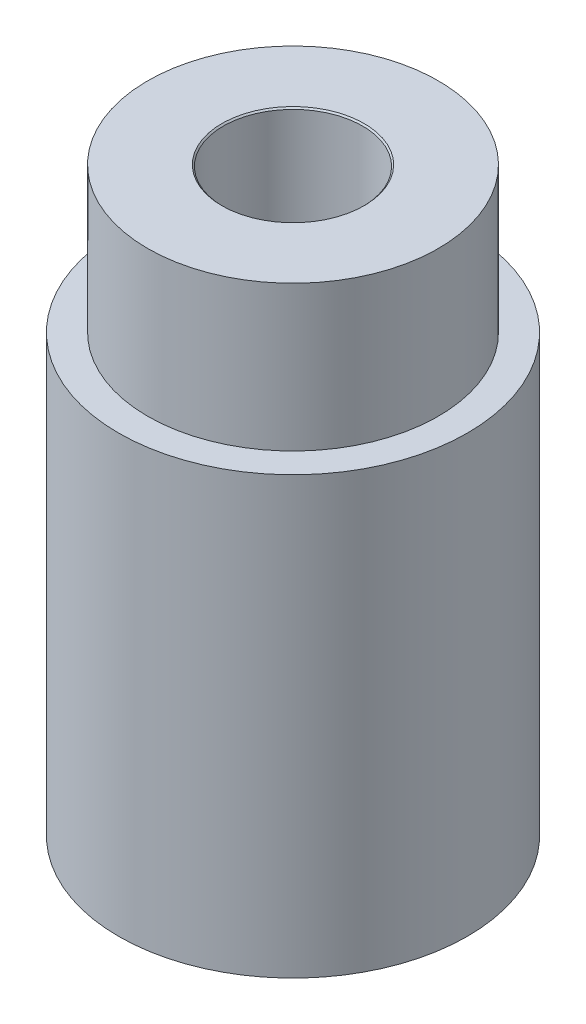
ISO-10303-21;
HEADER;
FILE_DESCRIPTION(('STEP AP214'),'2;1');
FILE_NAME('part.step','',(''),(''),'','','');
FILE_SCHEMA(('AUTOMOTIVE_DESIGN { 1 0 10303 214 1 1 1 1 }'));
ENDSEC;
DATA;
#1=APPLICATION_CONTEXT('core data for automotive mechanical design processes');
#2=APPLICATION_PROTOCOL_DEFINITION('international standard','automotive_design',2000,#1);
#3=PRODUCT_CONTEXT('',#1,'mechanical');
#4=PRODUCT('Part','Part','',(#3));
#5=PRODUCT_RELATED_PRODUCT_CATEGORY('part','',(#4));
#6=PRODUCT_DEFINITION_FORMATION('','',#4);
#7=PRODUCT_DEFINITION_CONTEXT('part definition',#1,'design');
#8=PRODUCT_DEFINITION('design','',#6,#7);
#9=PRODUCT_DEFINITION_SHAPE('','',#8);
#10=(LENGTH_UNIT() NAMED_UNIT(*) SI_UNIT(.MILLI.,.METRE.));
#11=(NAMED_UNIT(*) PLANE_ANGLE_UNIT() SI_UNIT($,.RADIAN.));
#12=(NAMED_UNIT(*) SI_UNIT($,.STERADIAN.) SOLID_ANGLE_UNIT());
#13=UNCERTAINTY_MEASURE_WITH_UNIT(LENGTH_MEASURE(1.E-05),#10,'distance_accuracy_value','');
#14=(GEOMETRIC_REPRESENTATION_CONTEXT(3) GLOBAL_UNCERTAINTY_ASSIGNED_CONTEXT((#13)) GLOBAL_UNIT_ASSIGNED_CONTEXT((#10,
#11,#12)) REPRESENTATION_CONTEXT('',''));
#15=CARTESIAN_POINT('',(0.,0.,0.));
#16=DIRECTION('',(0.,0.,1.));
#17=DIRECTION('',(1.,0.,0.));
#18=AXIS2_PLACEMENT_3D('',#15,#16,#17);
#19=CARTESIAN_POINT('',(0.,7.5,0.));
#20=DIRECTION('',(0.,-1.,0.));
#21=DIRECTION('',(0.,0.,-1.));
#22=AXIS2_PLACEMENT_3D('',#19,#20,#21);
#23=CYLINDRICAL_SURFACE('',#22,3.);
#24=CARTESIAN_POINT('',(0.,7.5,0.));
#25=DIRECTION('',(0.,1.,0.));
#26=DIRECTION('',(0.,0.,1.));
#27=AXIS2_PLACEMENT_3D('',#24,#25,#26);
#28=CIRCLE('',#27,3.);
#29=CARTESIAN_POINT('',(0.,7.5,3.));
#30=VERTEX_POINT('',#29);
#31=EDGE_CURVE('E46',#30,#30,#28,.T.);
#32=ORIENTED_EDGE('',*,*,#31,.F.);
#33=EDGE_LOOP('',(#32));
#34=FACE_BOUND('',#33,.T.);
#35=CARTESIAN_POINT('',(0.,0.,0.));
#36=DIRECTION('',(0.,1.,0.));
#37=DIRECTION('',(0.,0.,1.));
#38=AXIS2_PLACEMENT_3D('',#35,#36,#37);
#39=CIRCLE('',#38,3.);
#40=CARTESIAN_POINT('',(0.,0.,3.));
#41=VERTEX_POINT('',#40);
#42=EDGE_CURVE('E42',#41,#41,#39,.T.);
#43=ORIENTED_EDGE('',*,*,#42,.T.);
#44=EDGE_LOOP('',(#43));
#45=FACE_BOUND('',#44,.T.);
#46=ADVANCED_FACE('F39',(#34,#45),#23,.T.);
#47=CARTESIAN_POINT('',(0.,7.5,0.));
#48=DIRECTION('',(0.,1.,0.));
#49=DIRECTION('',(0.,0.,1.));
#50=AXIS2_PLACEMENT_3D('',#47,#48,#49);
#51=PLANE('',#50);
#52=CARTESIAN_POINT('',(0.,7.5,0.));
#53=DIRECTION('',(0.,1.,0.));
#54=DIRECTION('',(0.,0.,1.));
#55=AXIS2_PLACEMENT_3D('',#52,#53,#54);
#56=CIRCLE('',#55,2.5);
#57=CARTESIAN_POINT('',(0.,7.5,2.5));
#58=VERTEX_POINT('',#57);
#59=EDGE_CURVE('E10',#58,#58,#56,.T.);
#60=ORIENTED_EDGE('',*,*,#59,.F.);
#61=EDGE_LOOP('',(#60));
#62=FACE_BOUND('',#61,.T.);
#63=ORIENTED_EDGE('',*,*,#31,.T.);
#64=EDGE_LOOP('',(#63));
#65=FACE_BOUND('',#64,.T.);
#66=ADVANCED_FACE('F82',(#62,#65),#51,.T.);
#67=CARTESIAN_POINT('',(0.,0.,0.));
#68=DIRECTION('',(0.,1.,0.));
#69=DIRECTION('',(0.,0.,1.));
#70=AXIS2_PLACEMENT_3D('',#67,#68,#69);
#71=PLANE('',#70);
#72=CARTESIAN_POINT('',(0.,0.,0.));
#73=DIRECTION('',(0.,1.,0.));
#74=DIRECTION('',(0.,0.,1.));
#75=AXIS2_PLACEMENT_3D('',#72,#73,#74);
#76=CIRCLE('',#75,1.2);
#77=CARTESIAN_POINT('',(0.,0.,1.2));
#78=VERTEX_POINT('',#77);
#79=EDGE_CURVE('E55',#78,#78,#76,.T.);
#80=ORIENTED_EDGE('',*,*,#79,.T.);
#81=EDGE_LOOP('',(#80));
#82=FACE_BOUND('',#81,.T.);
#83=ORIENTED_EDGE('',*,*,#42,.F.);
#84=EDGE_LOOP('',(#83));
#85=FACE_BOUND('',#84,.T.);
#86=ADVANCED_FACE('F76',(#82,#85),#71,.F.);
#87=CARTESIAN_POINT('',(0.,10.,0.));
#88=DIRECTION('',(0.,-1.,0.));
#89=DIRECTION('',(0.,0.,-1.));
#90=AXIS2_PLACEMENT_3D('',#87,#88,#89);
#91=CYLINDRICAL_SURFACE('',#90,2.5);
#92=CARTESIAN_POINT('',(0.,10.,0.));
#93=DIRECTION('',(0.,1.,0.));
#94=DIRECTION('',(0.,0.,1.));
#95=AXIS2_PLACEMENT_3D('',#92,#93,#94);
#96=CIRCLE('',#95,2.5);
#97=CARTESIAN_POINT('',(0.,10.,2.5));
#98=VERTEX_POINT('',#97);
#99=EDGE_CURVE('E52',#98,#98,#96,.T.);
#100=ORIENTED_EDGE('',*,*,#99,.F.);
#101=EDGE_LOOP('',(#100));
#102=FACE_BOUND('',#101,.T.);
#103=ORIENTED_EDGE('',*,*,#59,.T.);
#104=EDGE_LOOP('',(#103));
#105=FACE_BOUND('',#104,.T.);
#106=ADVANCED_FACE('F71',(#102,#105),#91,.T.);
#107=CARTESIAN_POINT('',(0.,10.,0.));
#108=DIRECTION('',(0.,1.,0.));
#109=DIRECTION('',(0.,0.,1.));
#110=AXIS2_PLACEMENT_3D('',#107,#108,#109);
#111=PLANE('',#110);
#112=CARTESIAN_POINT('',(0.,10.,0.));
#113=DIRECTION('',(0.,1.,0.));
#114=DIRECTION('',(0.,0.,1.));
#115=AXIS2_PLACEMENT_3D('',#112,#113,#114);
#116=CIRCLE('',#115,1.225);
#117=CARTESIAN_POINT('',(0.,10.,1.225));
#118=VERTEX_POINT('',#117);
#119=EDGE_CURVE('E61',#118,#118,#116,.T.);
#120=ORIENTED_EDGE('',*,*,#119,.F.);
#121=EDGE_LOOP('',(#120));
#122=FACE_BOUND('',#121,.T.);
#123=ORIENTED_EDGE('',*,*,#99,.T.);
#124=EDGE_LOOP('',(#123));
#125=FACE_BOUND('',#124,.T.);
#126=ADVANCED_FACE('F67',(#122,#125),#111,.T.);
#127=CARTESIAN_POINT('',(0.,10.,0.));
#128=DIRECTION('',(0.,1.,0.));
#129=DIRECTION('',(0.,0.,1.));
#130=AXIS2_PLACEMENT_3D('',#127,#128,#129);
#131=CYLINDRICAL_SURFACE('',#130,1.2);
#132=ORIENTED_EDGE('',*,*,#79,.F.);
#133=EDGE_LOOP('',(#132));
#134=FACE_BOUND('',#133,.T.);
#135=CARTESIAN_POINT('',(0.,9.975,0.));
#136=DIRECTION('',(0.,1.,0.));
#137=DIRECTION('',(0.,0.,1.));
#138=AXIS2_PLACEMENT_3D('',#135,#136,#137);
#139=CIRCLE('',#138,1.2);
#140=CARTESIAN_POINT('',(0.,9.975,1.2));
#141=VERTEX_POINT('',#140);
#142=EDGE_CURVE('E58',#141,#141,#139,.T.);
#143=ORIENTED_EDGE('',*,*,#142,.T.);
#144=EDGE_LOOP('',(#143));
#145=FACE_BOUND('',#144,.T.);
#146=ADVANCED_FACE('F70',(#134,#145),#131,.F.);
#147=CARTESIAN_POINT('',(0.,10.,0.));
#148=DIRECTION('',(0.,1.,0.));
#149=DIRECTION('',(0.,0.,1.));
#150=AXIS2_PLACEMENT_3D('',#147,#148,#149);
#151=CONICAL_SURFACE('',#150,1.225,0.785398163397444);
#152=ORIENTED_EDGE('',*,*,#142,.F.);
#153=EDGE_LOOP('',(#152));
#154=FACE_BOUND('',#153,.T.);
#155=ORIENTED_EDGE('',*,*,#119,.T.);
#156=EDGE_LOOP('',(#155));
#157=FACE_BOUND('',#156,.T.);
#158=ADVANCED_FACE('F65',(#154,#157),#151,.F.);
#159=CLOSED_SHELL('',(#46,#66,#86,#106,#126,#146,#158));
#160=MANIFOLD_SOLID_BREP('B2',#159);
#161=ADVANCED_BREP_SHAPE_REPRESENTATION('',(#18,#160),#14);
#162=SHAPE_DEFINITION_REPRESENTATION(#9,#161);
ENDSEC;
END-ISO-10303-21;
